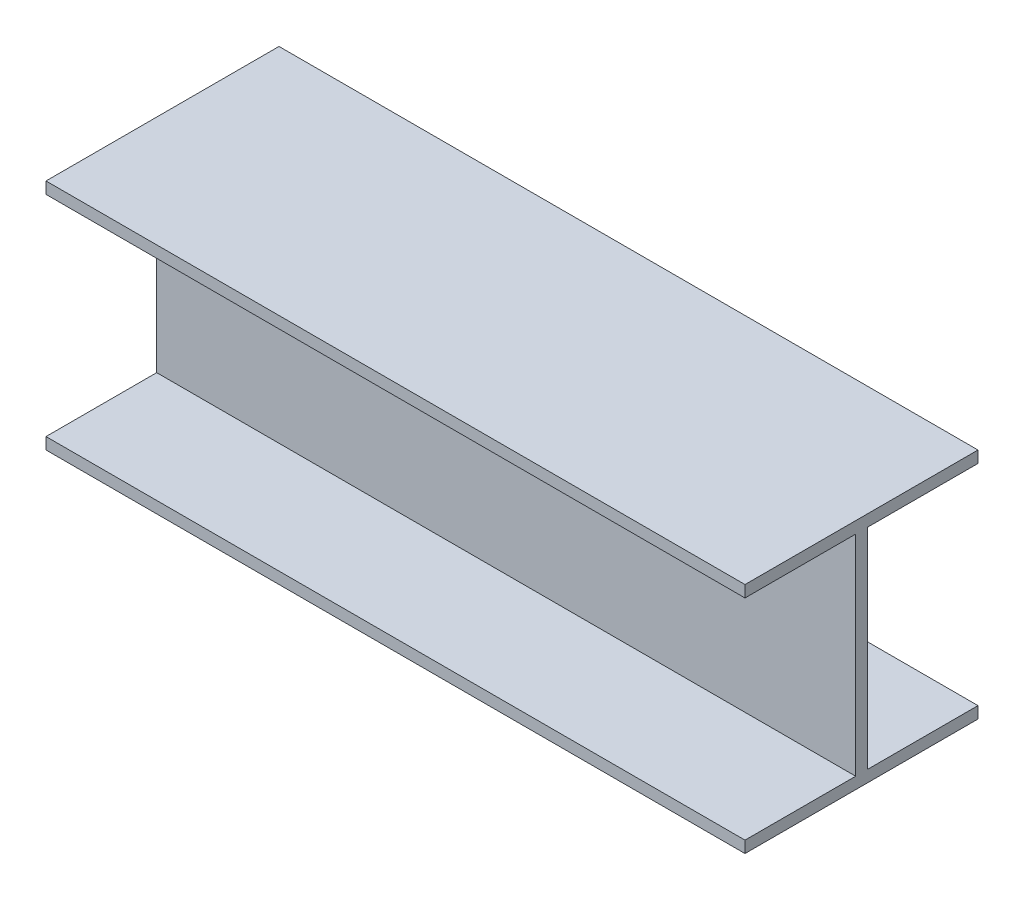
ISO-10303-21;
HEADER;
FILE_DESCRIPTION(('STEP AP214'),'2;1');
FILE_NAME('part.step','',(''),(''),'','','');
FILE_SCHEMA(('AUTOMOTIVE_DESIGN { 1 0 10303 214 1 1 1 1 }'));
ENDSEC;
DATA;
#1=APPLICATION_CONTEXT('core data for automotive mechanical design processes');
#2=APPLICATION_PROTOCOL_DEFINITION('international standard','automotive_design',2000,#1);
#3=PRODUCT_CONTEXT('',#1,'mechanical');
#4=PRODUCT('Part','Part','',(#3));
#5=PRODUCT_RELATED_PRODUCT_CATEGORY('part','',(#4));
#6=PRODUCT_DEFINITION_FORMATION('','',#4);
#7=PRODUCT_DEFINITION_CONTEXT('part definition',#1,'design');
#8=PRODUCT_DEFINITION('design','',#6,#7);
#9=PRODUCT_DEFINITION_SHAPE('','',#8);
#10=(LENGTH_UNIT() NAMED_UNIT(*) SI_UNIT(.MILLI.,.METRE.));
#11=(NAMED_UNIT(*) PLANE_ANGLE_UNIT() SI_UNIT($,.RADIAN.));
#12=(NAMED_UNIT(*) SI_UNIT($,.STERADIAN.) SOLID_ANGLE_UNIT());
#13=UNCERTAINTY_MEASURE_WITH_UNIT(LENGTH_MEASURE(1.E-05),#10,'distance_accuracy_value','');
#14=(GEOMETRIC_REPRESENTATION_CONTEXT(3) GLOBAL_UNCERTAINTY_ASSIGNED_CONTEXT((#13)) GLOBAL_UNIT_ASSIGNED_CONTEXT((#10,
#11,#12)) REPRESENTATION_CONTEXT('',''));
#15=CARTESIAN_POINT('',(0.,0.,0.));
#16=DIRECTION('',(0.,0.,1.));
#17=DIRECTION('',(1.,0.,0.));
#18=AXIS2_PLACEMENT_3D('',#15,#16,#17);
#19=CARTESIAN_POINT('',(600.,-90.,-100.));
#20=DIRECTION('',(0.,0.,1.));
#21=DIRECTION('',(1.,0.,0.));
#22=AXIS2_PLACEMENT_3D('',#19,#20,#21);
#23=PLANE('',#22);
#24=DIRECTION('',(0.,1.,0.));
#25=VECTOR('',#24,1.);
#26=CARTESIAN_POINT('',(0.,-90.,-100.));
#27=LINE('',#26,#25);
#28=CARTESIAN_POINT('',(0.,-100.,-100.));
#29=VERTEX_POINT('',#28);
#30=CARTESIAN_POINT('',(0.,-90.,-100.));
#31=VERTEX_POINT('',#30);
#32=EDGE_CURVE('E159',#29,#31,#27,.T.);
#33=ORIENTED_EDGE('',*,*,#32,.T.);
#34=DIRECTION('',(-1.,0.,0.));
#35=VECTOR('',#34,1.);
#36=CARTESIAN_POINT('',(600.,-90.,-100.));
#37=LINE('',#36,#35);
#38=CARTESIAN_POINT('',(600.,-90.,-100.));
#39=VERTEX_POINT('',#38);
#40=EDGE_CURVE('E11',#39,#31,#37,.T.);
#41=ORIENTED_EDGE('',*,*,#40,.F.);
#42=DIRECTION('',(0.,1.,0.));
#43=VECTOR('',#42,1.);
#44=CARTESIAN_POINT('',(600.,-90.,-100.));
#45=LINE('',#44,#43);
#46=CARTESIAN_POINT('',(600.,-100.,-100.));
#47=VERTEX_POINT('',#46);
#48=EDGE_CURVE('E181',#47,#39,#45,.T.);
#49=ORIENTED_EDGE('',*,*,#48,.F.);
#50=DIRECTION('',(-1.,0.,0.));
#51=VECTOR('',#50,1.);
#52=CARTESIAN_POINT('',(600.,-100.,-100.));
#53=LINE('',#52,#51);
#54=EDGE_CURVE('E155',#47,#29,#53,.T.);
#55=ORIENTED_EDGE('',*,*,#54,.T.);
#56=EDGE_LOOP('',(#33,#41,#49,#55));
#57=FACE_BOUND('',#56,.T.);
#58=ADVANCED_FACE('F39',(#57),#23,.F.);
#59=CARTESIAN_POINT('',(600.,-90.,-4.99999999999998));
#60=DIRECTION('',(0.,-1.,0.));
#61=DIRECTION('',(0.,0.,-1.));
#62=AXIS2_PLACEMENT_3D('',#59,#60,#61);
#63=PLANE('',#62);
#64=DIRECTION('',(0.,0.,1.));
#65=VECTOR('',#64,1.);
#66=CARTESIAN_POINT('',(0.,-90.,-4.99999999999998));
#67=LINE('',#66,#65);
#68=CARTESIAN_POINT('',(0.,-90.,-4.99999999999998));
#69=VERTEX_POINT('',#68);
#70=EDGE_CURVE('E162',#31,#69,#67,.T.);
#71=ORIENTED_EDGE('',*,*,#70,.T.);
#72=DIRECTION('',(-1.,0.,0.));
#73=VECTOR('',#72,1.);
#74=CARTESIAN_POINT('',(600.,-90.,-4.99999999999998));
#75=LINE('',#74,#73);
#76=CARTESIAN_POINT('',(600.,-90.,-4.99999999999998));
#77=VERTEX_POINT('',#76);
#78=EDGE_CURVE('E47',#77,#69,#75,.T.);
#79=ORIENTED_EDGE('',*,*,#78,.F.);
#80=DIRECTION('',(0.,0.,1.));
#81=VECTOR('',#80,1.);
#82=CARTESIAN_POINT('',(600.,-90.,-4.99999999999998));
#83=LINE('',#82,#81);
#84=EDGE_CURVE('E110',#39,#77,#83,.T.);
#85=ORIENTED_EDGE('',*,*,#84,.F.);
#86=ORIENTED_EDGE('',*,*,#40,.T.);
#87=EDGE_LOOP('',(#71,#79,#85,#86));
#88=FACE_BOUND('',#87,.T.);
#89=ADVANCED_FACE('F259',(#88),#63,.F.);
#90=CARTESIAN_POINT('',(600.,90.,-5.));
#91=DIRECTION('',(0.,0.,1.));
#92=DIRECTION('',(0.,-1.,0.));
#93=AXIS2_PLACEMENT_3D('',#90,#91,#92);
#94=PLANE('',#93);
#95=DIRECTION('',(0.,1.,0.));
#96=VECTOR('',#95,1.);
#97=CARTESIAN_POINT('',(0.,90.,-5.));
#98=LINE('',#97,#96);
#99=CARTESIAN_POINT('',(0.,90.,-5.));
#100=VERTEX_POINT('',#99);
#101=EDGE_CURVE('E164',#69,#100,#98,.T.);
#102=ORIENTED_EDGE('',*,*,#101,.T.);
#103=DIRECTION('',(-1.,0.,0.));
#104=VECTOR('',#103,1.);
#105=CARTESIAN_POINT('',(600.,90.,-5.));
#106=LINE('',#105,#104);
#107=CARTESIAN_POINT('',(600.,90.,-5.));
#108=VERTEX_POINT('',#107);
#109=EDGE_CURVE('E200',#108,#100,#106,.T.);
#110=ORIENTED_EDGE('',*,*,#109,.F.);
#111=DIRECTION('',(0.,1.,0.));
#112=VECTOR('',#111,1.);
#113=CARTESIAN_POINT('',(600.,90.,-5.));
#114=LINE('',#113,#112);
#115=EDGE_CURVE('E208',#77,#108,#114,.T.);
#116=ORIENTED_EDGE('',*,*,#115,.F.);
#117=ORIENTED_EDGE('',*,*,#78,.T.);
#118=EDGE_LOOP('',(#102,#110,#116,#117));
#119=FACE_BOUND('',#118,.T.);
#120=ADVANCED_FACE('F206',(#119),#94,.F.);
#121=CARTESIAN_POINT('',(600.,90.,-100.));
#122=DIRECTION('',(0.,1.,0.));
#123=DIRECTION('',(0.,0.,1.));
#124=AXIS2_PLACEMENT_3D('',#121,#122,#123);
#125=PLANE('',#124);
#126=DIRECTION('',(0.,0.,-1.));
#127=VECTOR('',#126,1.);
#128=CARTESIAN_POINT('',(0.,90.,-100.));
#129=LINE('',#128,#127);
#130=CARTESIAN_POINT('',(0.,90.,-100.));
#131=VERTEX_POINT('',#130);
#132=EDGE_CURVE('E166',#100,#131,#129,.T.);
#133=ORIENTED_EDGE('',*,*,#132,.T.);
#134=DIRECTION('',(-1.,0.,0.));
#135=VECTOR('',#134,1.);
#136=CARTESIAN_POINT('',(600.,90.,-100.));
#137=LINE('',#136,#135);
#138=CARTESIAN_POINT('',(600.,90.,-100.));
#139=VERTEX_POINT('',#138);
#140=EDGE_CURVE('E197',#139,#131,#137,.T.);
#141=ORIENTED_EDGE('',*,*,#140,.F.);
#142=DIRECTION('',(0.,0.,-1.));
#143=VECTOR('',#142,1.);
#144=CARTESIAN_POINT('',(600.,90.,-100.));
#145=LINE('',#144,#143);
#146=EDGE_CURVE('E226',#108,#139,#145,.T.);
#147=ORIENTED_EDGE('',*,*,#146,.F.);
#148=ORIENTED_EDGE('',*,*,#109,.T.);
#149=EDGE_LOOP('',(#133,#141,#147,#148));
#150=FACE_BOUND('',#149,.T.);
#151=ADVANCED_FACE('F217',(#150),#125,.F.);
#152=CARTESIAN_POINT('',(600.,100.,-100.));
#153=DIRECTION('',(0.,0.,1.));
#154=DIRECTION('',(0.,-1.,0.));
#155=AXIS2_PLACEMENT_3D('',#152,#153,#154);
#156=PLANE('',#155);
#157=DIRECTION('',(0.,1.,0.));
#158=VECTOR('',#157,1.);
#159=CARTESIAN_POINT('',(0.,100.,-100.));
#160=LINE('',#159,#158);
#161=CARTESIAN_POINT('',(0.,100.,-100.));
#162=VERTEX_POINT('',#161);
#163=EDGE_CURVE('E168',#131,#162,#160,.T.);
#164=ORIENTED_EDGE('',*,*,#163,.T.);
#165=DIRECTION('',(-1.,0.,0.));
#166=VECTOR('',#165,1.);
#167=CARTESIAN_POINT('',(600.,100.,-100.));
#168=LINE('',#167,#166);
#169=CARTESIAN_POINT('',(600.,100.,-100.));
#170=VERTEX_POINT('',#169);
#171=EDGE_CURVE('E194',#170,#162,#168,.T.);
#172=ORIENTED_EDGE('',*,*,#171,.F.);
#173=DIRECTION('',(0.,1.,0.));
#174=VECTOR('',#173,1.);
#175=CARTESIAN_POINT('',(600.,100.,-100.));
#176=LINE('',#175,#174);
#177=EDGE_CURVE('E223',#139,#170,#176,.T.);
#178=ORIENTED_EDGE('',*,*,#177,.F.);
#179=ORIENTED_EDGE('',*,*,#140,.T.);
#180=EDGE_LOOP('',(#164,#172,#178,#179));
#181=FACE_BOUND('',#180,.T.);
#182=ADVANCED_FACE('F221',(#181),#156,.F.);
#183=CARTESIAN_POINT('',(600.,100.,-100.));
#184=DIRECTION('',(0.,-1.,0.));
#185=DIRECTION('',(0.,0.,-1.));
#186=AXIS2_PLACEMENT_3D('',#183,#184,#185);
#187=PLANE('',#186);
#188=DIRECTION('',(0.,0.,1.));
#189=VECTOR('',#188,1.);
#190=CARTESIAN_POINT('',(0.,100.,-100.));
#191=LINE('',#190,#189);
#192=CARTESIAN_POINT('',(0.,100.,100.));
#193=VERTEX_POINT('',#192);
#194=EDGE_CURVE('E170',#162,#193,#191,.T.);
#195=ORIENTED_EDGE('',*,*,#194,.T.);
#196=DIRECTION('',(-1.,0.,0.));
#197=VECTOR('',#196,1.);
#198=CARTESIAN_POINT('',(600.,100.,100.));
#199=LINE('',#198,#197);
#200=CARTESIAN_POINT('',(600.,100.,100.));
#201=VERTEX_POINT('',#200);
#202=EDGE_CURVE('E191',#201,#193,#199,.T.);
#203=ORIENTED_EDGE('',*,*,#202,.F.);
#204=DIRECTION('',(0.,0.,1.));
#205=VECTOR('',#204,1.);
#206=CARTESIAN_POINT('',(600.,100.,-100.));
#207=LINE('',#206,#205);
#208=EDGE_CURVE('E225',#170,#201,#207,.T.);
#209=ORIENTED_EDGE('',*,*,#208,.F.);
#210=ORIENTED_EDGE('',*,*,#171,.T.);
#211=EDGE_LOOP('',(#195,#203,#209,#210));
#212=FACE_BOUND('',#211,.T.);
#213=ADVANCED_FACE('F272',(#212),#187,.F.);
#214=CARTESIAN_POINT('',(600.,100.,100.));
#215=DIRECTION('',(0.,0.,-1.));
#216=DIRECTION('',(0.,1.,0.));
#217=AXIS2_PLACEMENT_3D('',#214,#215,#216);
#218=PLANE('',#217);
#219=DIRECTION('',(0.,-1.,0.));
#220=VECTOR('',#219,1.);
#221=CARTESIAN_POINT('',(0.,100.,100.));
#222=LINE('',#221,#220);
#223=CARTESIAN_POINT('',(0.,90.,100.));
#224=VERTEX_POINT('',#223);
#225=EDGE_CURVE('E172',#193,#224,#222,.T.);
#226=ORIENTED_EDGE('',*,*,#225,.T.);
#227=DIRECTION('',(-1.,0.,0.));
#228=VECTOR('',#227,1.);
#229=CARTESIAN_POINT('',(600.,90.,100.));
#230=LINE('',#229,#228);
#231=CARTESIAN_POINT('',(600.,90.,100.));
#232=VERTEX_POINT('',#231);
#233=EDGE_CURVE('E188',#232,#224,#230,.T.);
#234=ORIENTED_EDGE('',*,*,#233,.F.);
#235=DIRECTION('',(0.,-1.,0.));
#236=VECTOR('',#235,1.);
#237=CARTESIAN_POINT('',(600.,100.,100.));
#238=LINE('',#237,#236);
#239=EDGE_CURVE('E228',#201,#232,#238,.T.);
#240=ORIENTED_EDGE('',*,*,#239,.F.);
#241=ORIENTED_EDGE('',*,*,#202,.T.);
#242=EDGE_LOOP('',(#226,#234,#240,#241));
#243=FACE_BOUND('',#242,.T.);
#244=ADVANCED_FACE('F275',(#243),#218,.F.);
#245=CARTESIAN_POINT('',(600.,90.,100.));
#246=DIRECTION('',(0.,1.,0.));
#247=DIRECTION('',(0.,0.,1.));
#248=AXIS2_PLACEMENT_3D('',#245,#246,#247);
#249=PLANE('',#248);
#250=DIRECTION('',(0.,0.,-1.));
#251=VECTOR('',#250,1.);
#252=CARTESIAN_POINT('',(0.,90.,100.));
#253=LINE('',#252,#251);
#254=CARTESIAN_POINT('',(0.,90.,5.));
#255=VERTEX_POINT('',#254);
#256=EDGE_CURVE('E174',#224,#255,#253,.T.);
#257=ORIENTED_EDGE('',*,*,#256,.T.);
#258=DIRECTION('',(-1.,0.,0.));
#259=VECTOR('',#258,1.);
#260=CARTESIAN_POINT('',(600.,90.,5.));
#261=LINE('',#260,#259);
#262=CARTESIAN_POINT('',(600.,90.,5.));
#263=VERTEX_POINT('',#262);
#264=EDGE_CURVE('E185',#263,#255,#261,.T.);
#265=ORIENTED_EDGE('',*,*,#264,.F.);
#266=DIRECTION('',(0.,0.,-1.));
#267=VECTOR('',#266,1.);
#268=CARTESIAN_POINT('',(600.,90.,100.));
#269=LINE('',#268,#267);
#270=EDGE_CURVE('E234',#232,#263,#269,.T.);
#271=ORIENTED_EDGE('',*,*,#270,.F.);
#272=ORIENTED_EDGE('',*,*,#233,.T.);
#273=EDGE_LOOP('',(#257,#265,#271,#272));
#274=FACE_BOUND('',#273,.T.);
#275=ADVANCED_FACE('F240',(#274),#249,.F.);
#276=CARTESIAN_POINT('',(600.,90.,5.));
#277=DIRECTION('',(0.,0.,-1.));
#278=DIRECTION('',(0.,1.,0.));
#279=AXIS2_PLACEMENT_3D('',#276,#277,#278);
#280=PLANE('',#279);
#281=DIRECTION('',(0.,-1.,0.));
#282=VECTOR('',#281,1.);
#283=CARTESIAN_POINT('',(0.,90.,5.));
#284=LINE('',#283,#282);
#285=CARTESIAN_POINT('',(0.,-90.,4.99999999999998));
#286=VERTEX_POINT('',#285);
#287=EDGE_CURVE('E176',#255,#286,#284,.T.);
#288=ORIENTED_EDGE('',*,*,#287,.T.);
#289=DIRECTION('',(-1.,0.,0.));
#290=VECTOR('',#289,1.);
#291=CARTESIAN_POINT('',(600.,-90.,4.99999999999998));
#292=LINE('',#291,#290);
#293=CARTESIAN_POINT('',(600.,-90.,4.99999999999998));
#294=VERTEX_POINT('',#293);
#295=EDGE_CURVE('E150',#294,#286,#292,.T.);
#296=ORIENTED_EDGE('',*,*,#295,.F.);
#297=DIRECTION('',(0.,-1.,0.));
#298=VECTOR('',#297,1.);
#299=CARTESIAN_POINT('',(600.,90.,5.));
#300=LINE('',#299,#298);
#301=EDGE_CURVE('E141',#263,#294,#300,.T.);
#302=ORIENTED_EDGE('',*,*,#301,.F.);
#303=ORIENTED_EDGE('',*,*,#264,.T.);
#304=EDGE_LOOP('',(#288,#296,#302,#303));
#305=FACE_BOUND('',#304,.T.);
#306=ADVANCED_FACE('F244',(#305),#280,.F.);
#307=CARTESIAN_POINT('',(600.,-90.,4.99999999999998));
#308=DIRECTION('',(0.,-1.,0.));
#309=DIRECTION('',(0.,0.,-1.));
#310=AXIS2_PLACEMENT_3D('',#307,#308,#309);
#311=PLANE('',#310);
#312=DIRECTION('',(0.,0.,1.));
#313=VECTOR('',#312,1.);
#314=CARTESIAN_POINT('',(0.,-90.,4.99999999999998));
#315=LINE('',#314,#313);
#316=CARTESIAN_POINT('',(0.,-90.,100.));
#317=VERTEX_POINT('',#316);
#318=EDGE_CURVE('E149',#286,#317,#315,.T.);
#319=ORIENTED_EDGE('',*,*,#318,.T.);
#320=DIRECTION('',(-1.,0.,0.));
#321=VECTOR('',#320,1.);
#322=CARTESIAN_POINT('',(600.,-90.,100.));
#323=LINE('',#322,#321);
#324=CARTESIAN_POINT('',(600.,-90.,100.));
#325=VERTEX_POINT('',#324);
#326=EDGE_CURVE('E146',#325,#317,#323,.T.);
#327=ORIENTED_EDGE('',*,*,#326,.F.);
#328=DIRECTION('',(0.,0.,1.));
#329=VECTOR('',#328,1.);
#330=CARTESIAN_POINT('',(600.,-90.,4.99999999999998));
#331=LINE('',#330,#329);
#332=EDGE_CURVE('E135',#294,#325,#331,.T.);
#333=ORIENTED_EDGE('',*,*,#332,.F.);
#334=ORIENTED_EDGE('',*,*,#295,.T.);
#335=EDGE_LOOP('',(#319,#327,#333,#334));
#336=FACE_BOUND('',#335,.T.);
#337=ADVANCED_FACE('F147',(#336),#311,.F.);
#338=CARTESIAN_POINT('',(600.,-90.,100.));
#339=DIRECTION('',(0.,0.,-1.));
#340=DIRECTION('',(-1.,0.,0.));
#341=AXIS2_PLACEMENT_3D('',#338,#339,#340);
#342=PLANE('',#341);
#343=DIRECTION('',(0.,-1.,0.));
#344=VECTOR('',#343,1.);
#345=CARTESIAN_POINT('',(0.,-90.,100.));
#346=LINE('',#345,#344);
#347=CARTESIAN_POINT('',(0.,-100.,100.));
#348=VERTEX_POINT('',#347);
#349=EDGE_CURVE('E96',#317,#348,#346,.T.);
#350=ORIENTED_EDGE('',*,*,#349,.T.);
#351=DIRECTION('',(-1.,0.,0.));
#352=VECTOR('',#351,1.);
#353=CARTESIAN_POINT('',(600.,-100.,100.));
#354=LINE('',#353,#352);
#355=CARTESIAN_POINT('',(600.,-100.,100.));
#356=VERTEX_POINT('',#355);
#357=EDGE_CURVE('E151',#356,#348,#354,.T.);
#358=ORIENTED_EDGE('',*,*,#357,.F.);
#359=DIRECTION('',(0.,-1.,0.));
#360=VECTOR('',#359,1.);
#361=CARTESIAN_POINT('',(600.,-90.,100.));
#362=LINE('',#361,#360);
#363=EDGE_CURVE('E139',#325,#356,#362,.T.);
#364=ORIENTED_EDGE('',*,*,#363,.F.);
#365=ORIENTED_EDGE('',*,*,#326,.T.);
#366=EDGE_LOOP('',(#350,#358,#364,#365));
#367=FACE_BOUND('',#366,.T.);
#368=ADVANCED_FACE('F153',(#367),#342,.F.);
#369=CARTESIAN_POINT('',(600.,-100.,100.));
#370=DIRECTION('',(0.,1.,0.));
#371=DIRECTION('',(0.,0.,1.));
#372=AXIS2_PLACEMENT_3D('',#369,#370,#371);
#373=PLANE('',#372);
#374=DIRECTION('',(0.,0.,-1.));
#375=VECTOR('',#374,1.);
#376=CARTESIAN_POINT('',(0.,-100.,100.));
#377=LINE('',#376,#375);
#378=EDGE_CURVE('E102',#348,#29,#377,.T.);
#379=ORIENTED_EDGE('',*,*,#378,.T.);
#380=ORIENTED_EDGE('',*,*,#54,.F.);
#381=DIRECTION('',(0.,0.,-1.));
#382=VECTOR('',#381,1.);
#383=CARTESIAN_POINT('',(600.,-100.,100.));
#384=LINE('',#383,#382);
#385=EDGE_CURVE('E55',#356,#47,#384,.T.);
#386=ORIENTED_EDGE('',*,*,#385,.F.);
#387=ORIENTED_EDGE('',*,*,#357,.T.);
#388=EDGE_LOOP('',(#379,#380,#386,#387));
#389=FACE_BOUND('',#388,.T.);
#390=ADVANCED_FACE('F248',(#389),#373,.F.);
#391=CARTESIAN_POINT('',(600.,0.,0.));
#392=DIRECTION('',(1.,0.,0.));
#393=DIRECTION('',(0.,0.,-1.));
#394=AXIS2_PLACEMENT_3D('',#391,#392,#393);
#395=PLANE('',#394);
#396=ORIENTED_EDGE('',*,*,#48,.T.);
#397=ORIENTED_EDGE('',*,*,#84,.T.);
#398=ORIENTED_EDGE('',*,*,#115,.T.);
#399=ORIENTED_EDGE('',*,*,#146,.T.);
#400=ORIENTED_EDGE('',*,*,#177,.T.);
#401=ORIENTED_EDGE('',*,*,#208,.T.);
#402=ORIENTED_EDGE('',*,*,#239,.T.);
#403=ORIENTED_EDGE('',*,*,#270,.T.);
#404=ORIENTED_EDGE('',*,*,#301,.T.);
#405=ORIENTED_EDGE('',*,*,#332,.T.);
#406=ORIENTED_EDGE('',*,*,#363,.T.);
#407=ORIENTED_EDGE('',*,*,#385,.T.);
#408=EDGE_LOOP('',(#396,#397,#398,#399,#400,#401,#402,#403,#404,#405,#406,#407));
#409=FACE_BOUND('',#408,.T.);
#410=ADVANCED_FACE('F137',(#409),#395,.T.);
#411=CARTESIAN_POINT('',(0.,0.,0.));
#412=DIRECTION('',(1.,0.,0.));
#413=DIRECTION('',(0.,0.,-1.));
#414=AXIS2_PLACEMENT_3D('',#411,#412,#413);
#415=PLANE('',#414);
#416=ORIENTED_EDGE('',*,*,#32,.F.);
#417=ORIENTED_EDGE('',*,*,#378,.F.);
#418=ORIENTED_EDGE('',*,*,#349,.F.);
#419=ORIENTED_EDGE('',*,*,#318,.F.);
#420=ORIENTED_EDGE('',*,*,#287,.F.);
#421=ORIENTED_EDGE('',*,*,#256,.F.);
#422=ORIENTED_EDGE('',*,*,#225,.F.);
#423=ORIENTED_EDGE('',*,*,#194,.F.);
#424=ORIENTED_EDGE('',*,*,#163,.F.);
#425=ORIENTED_EDGE('',*,*,#132,.F.);
#426=ORIENTED_EDGE('',*,*,#101,.F.);
#427=ORIENTED_EDGE('',*,*,#70,.F.);
#428=EDGE_LOOP('',(#416,#417,#418,#419,#420,#421,#422,#423,#424,#425,#426,#427));
#429=FACE_BOUND('',#428,.T.);
#430=ADVANCED_FACE('F212',(#429),#415,.F.);
#431=CLOSED_SHELL('',(#58,#89,#120,#151,#182,#213,#244,#275,#306,#337,#368,#390,#410,#430));
#432=MANIFOLD_SOLID_BREP('B2',#431);
#433=ADVANCED_BREP_SHAPE_REPRESENTATION('',(#18,#432),#14);
#434=SHAPE_DEFINITION_REPRESENTATION(#9,#433);
ENDSEC;
END-ISO-10303-21;
